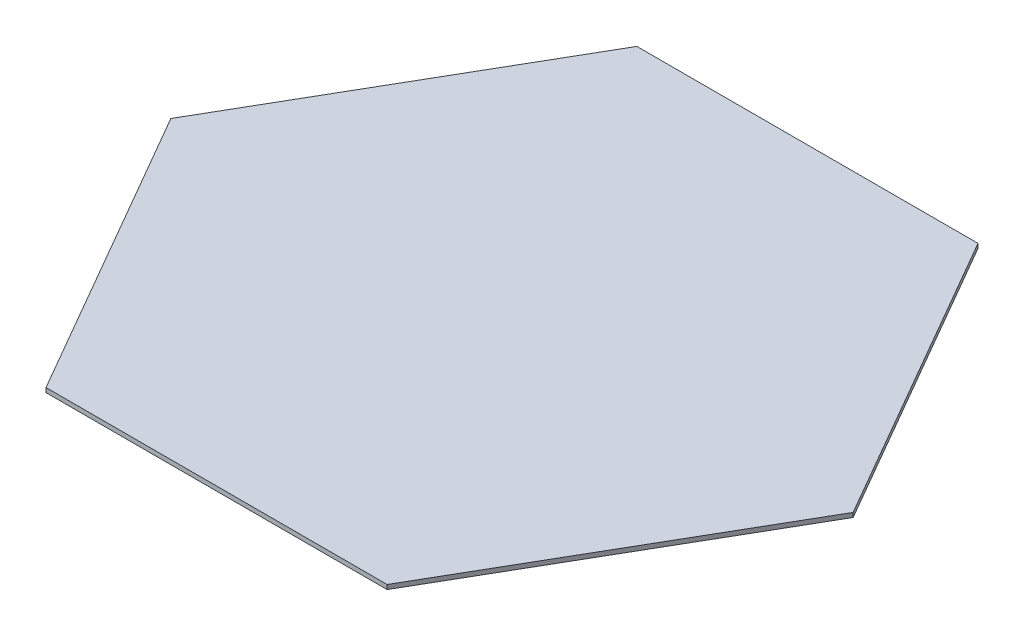
ISO-10303-21;
HEADER;
FILE_DESCRIPTION(('STEP AP214'),'2;1');
FILE_NAME('part.step','',(''),(''),'','','');
FILE_SCHEMA(('AUTOMOTIVE_DESIGN { 1 0 10303 214 1 1 1 1 }'));
ENDSEC;
DATA;
#1=APPLICATION_CONTEXT('core data for automotive mechanical design processes');
#2=APPLICATION_PROTOCOL_DEFINITION('international standard','automotive_design',2000,#1);
#3=PRODUCT_CONTEXT('',#1,'mechanical');
#4=PRODUCT('Part','Part','',(#3));
#5=PRODUCT_RELATED_PRODUCT_CATEGORY('part','',(#4));
#6=PRODUCT_DEFINITION_FORMATION('','',#4);
#7=PRODUCT_DEFINITION_CONTEXT('part definition',#1,'design');
#8=PRODUCT_DEFINITION('design','',#6,#7);
#9=PRODUCT_DEFINITION_SHAPE('','',#8);
#10=(LENGTH_UNIT() NAMED_UNIT(*) SI_UNIT(.MILLI.,.METRE.));
#11=(NAMED_UNIT(*) PLANE_ANGLE_UNIT() SI_UNIT($,.RADIAN.));
#12=(NAMED_UNIT(*) SI_UNIT($,.STERADIAN.) SOLID_ANGLE_UNIT());
#13=UNCERTAINTY_MEASURE_WITH_UNIT(LENGTH_MEASURE(1.E-05),#10,'distance_accuracy_value','');
#14=(GEOMETRIC_REPRESENTATION_CONTEXT(3) GLOBAL_UNCERTAINTY_ASSIGNED_CONTEXT((#13)) GLOBAL_UNIT_ASSIGNED_CONTEXT((#10,
#11,#12)) REPRESENTATION_CONTEXT('',''));
#15=CARTESIAN_POINT('',(0.,0.,0.));
#16=DIRECTION('',(0.,0.,1.));
#17=DIRECTION('',(1.,0.,0.));
#18=AXIS2_PLACEMENT_3D('',#15,#16,#17);
#19=CARTESIAN_POINT('',(115.470053837925,3.,200.));
#20=DIRECTION('',(-0.866025403784439,0.,-0.5));
#21=DIRECTION('',(-0.5,0.,0.866025403784439));
#22=AXIS2_PLACEMENT_3D('',#19,#20,#21);
#23=PLANE('',#22);
#24=DIRECTION('',(0.5,0.,-0.866025403784439));
#25=VECTOR('',#24,1.);
#26=CARTESIAN_POINT('',(115.470053837925,0.,200.));
#27=LINE('',#26,#25);
#28=CARTESIAN_POINT('',(115.470053837925,0.,200.));
#29=VERTEX_POINT('',#28);
#30=CARTESIAN_POINT('',(230.94010767585,0.,0.));
#31=VERTEX_POINT('',#30);
#32=EDGE_CURVE('E120',#29,#31,#27,.T.);
#33=ORIENTED_EDGE('',*,*,#32,.T.);
#34=DIRECTION('',(0.,-1.,0.));
#35=VECTOR('',#34,1.);
#36=CARTESIAN_POINT('',(230.94010767585,3.,0.));
#37=LINE('',#36,#35);
#38=CARTESIAN_POINT('',(230.94010767585,3.,0.));
#39=VERTEX_POINT('',#38);
#40=EDGE_CURVE('E11',#39,#31,#37,.T.);
#41=ORIENTED_EDGE('',*,*,#40,.F.);
#42=DIRECTION('',(0.5,0.,-0.866025403784439));
#43=VECTOR('',#42,1.);
#44=CARTESIAN_POINT('',(115.470053837925,3.,200.));
#45=LINE('',#44,#43);
#46=CARTESIAN_POINT('',(115.470053837925,3.,200.));
#47=VERTEX_POINT('',#46);
#48=EDGE_CURVE('E130',#47,#39,#45,.T.);
#49=ORIENTED_EDGE('',*,*,#48,.F.);
#50=DIRECTION('',(0.,-1.,0.));
#51=VECTOR('',#50,1.);
#52=CARTESIAN_POINT('',(115.470053837925,3.,200.));
#53=LINE('',#52,#51);
#54=EDGE_CURVE('E116',#47,#29,#53,.T.);
#55=ORIENTED_EDGE('',*,*,#54,.T.);
#56=EDGE_LOOP('',(#33,#41,#49,#55));
#57=FACE_BOUND('',#56,.T.);
#58=ADVANCED_FACE('F36',(#57),#23,.F.);
#59=CARTESIAN_POINT('',(230.94010767585,3.,0.));
#60=DIRECTION('',(-0.866025403784439,0.,0.5));
#61=DIRECTION('',(0.5,0.,0.866025403784439));
#62=AXIS2_PLACEMENT_3D('',#59,#60,#61);
#63=PLANE('',#62);
#64=DIRECTION('',(-0.5,0.,-0.866025403784439));
#65=VECTOR('',#64,1.);
#66=CARTESIAN_POINT('',(230.94010767585,0.,0.));
#67=LINE('',#66,#65);
#68=CARTESIAN_POINT('',(115.470053837925,0.,-200.));
#69=VERTEX_POINT('',#68);
#70=EDGE_CURVE('E123',#31,#69,#67,.T.);
#71=ORIENTED_EDGE('',*,*,#70,.T.);
#72=DIRECTION('',(0.,-1.,0.));
#73=VECTOR('',#72,1.);
#74=CARTESIAN_POINT('',(115.470053837925,3.,-200.));
#75=LINE('',#74,#73);
#76=CARTESIAN_POINT('',(115.470053837925,3.,-200.));
#77=VERTEX_POINT('',#76);
#78=EDGE_CURVE('E44',#77,#69,#75,.T.);
#79=ORIENTED_EDGE('',*,*,#78,.F.);
#80=DIRECTION('',(-0.5,0.,-0.866025403784439));
#81=VECTOR('',#80,1.);
#82=CARTESIAN_POINT('',(230.94010767585,3.,0.));
#83=LINE('',#82,#81);
#84=EDGE_CURVE('E89',#39,#77,#83,.T.);
#85=ORIENTED_EDGE('',*,*,#84,.F.);
#86=ORIENTED_EDGE('',*,*,#40,.T.);
#87=EDGE_LOOP('',(#71,#79,#85,#86));
#88=FACE_BOUND('',#87,.T.);
#89=ADVANCED_FACE('F154',(#88),#63,.F.);
#90=CARTESIAN_POINT('',(115.470053837925,3.,-200.));
#91=DIRECTION('',(0.,0.,1.));
#92=DIRECTION('',(1.,0.,0.));
#93=AXIS2_PLACEMENT_3D('',#90,#91,#92);
#94=PLANE('',#93);
#95=DIRECTION('',(-1.,0.,0.));
#96=VECTOR('',#95,1.);
#97=CARTESIAN_POINT('',(115.470053837925,0.,-200.));
#98=LINE('',#97,#96);
#99=CARTESIAN_POINT('',(-115.470053837925,0.,-200.));
#100=VERTEX_POINT('',#99);
#101=EDGE_CURVE('E125',#69,#100,#98,.T.);
#102=ORIENTED_EDGE('',*,*,#101,.T.);
#103=DIRECTION('',(0.,-1.,0.));
#104=VECTOR('',#103,1.);
#105=CARTESIAN_POINT('',(-115.470053837925,3.,-200.));
#106=LINE('',#105,#104);
#107=CARTESIAN_POINT('',(-115.470053837925,3.,-200.));
#108=VERTEX_POINT('',#107);
#109=EDGE_CURVE('E111',#108,#100,#106,.T.);
#110=ORIENTED_EDGE('',*,*,#109,.F.);
#111=DIRECTION('',(-1.,0.,0.));
#112=VECTOR('',#111,1.);
#113=CARTESIAN_POINT('',(115.470053837925,3.,-200.));
#114=LINE('',#113,#112);
#115=EDGE_CURVE('E102',#77,#108,#114,.T.);
#116=ORIENTED_EDGE('',*,*,#115,.F.);
#117=ORIENTED_EDGE('',*,*,#78,.T.);
#118=EDGE_LOOP('',(#102,#110,#116,#117));
#119=FACE_BOUND('',#118,.T.);
#120=ADVANCED_FACE('F136',(#119),#94,.F.);
#121=CARTESIAN_POINT('',(-115.470053837925,3.,-200.));
#122=DIRECTION('',(0.866025403784439,0.,0.5));
#123=DIRECTION('',(0.5,0.,-0.866025403784439));
#124=AXIS2_PLACEMENT_3D('',#121,#122,#123);
#125=PLANE('',#124);
#126=DIRECTION('',(-0.5,0.,0.866025403784439));
#127=VECTOR('',#126,1.);
#128=CARTESIAN_POINT('',(-115.470053837925,0.,-200.));
#129=LINE('',#128,#127);
#130=CARTESIAN_POINT('',(-230.94010767585,0.,0.));
#131=VERTEX_POINT('',#130);
#132=EDGE_CURVE('E110',#100,#131,#129,.T.);
#133=ORIENTED_EDGE('',*,*,#132,.T.);
#134=DIRECTION('',(0.,-1.,0.));
#135=VECTOR('',#134,1.);
#136=CARTESIAN_POINT('',(-230.94010767585,3.,0.));
#137=LINE('',#136,#135);
#138=CARTESIAN_POINT('',(-230.94010767585,3.,0.));
#139=VERTEX_POINT('',#138);
#140=EDGE_CURVE('E107',#139,#131,#137,.T.);
#141=ORIENTED_EDGE('',*,*,#140,.F.);
#142=DIRECTION('',(-0.5,0.,0.866025403784439));
#143=VECTOR('',#142,1.);
#144=CARTESIAN_POINT('',(-115.470053837925,3.,-200.));
#145=LINE('',#144,#143);
#146=EDGE_CURVE('E96',#108,#139,#145,.T.);
#147=ORIENTED_EDGE('',*,*,#146,.F.);
#148=ORIENTED_EDGE('',*,*,#109,.T.);
#149=EDGE_LOOP('',(#133,#141,#147,#148));
#150=FACE_BOUND('',#149,.T.);
#151=ADVANCED_FACE('F108',(#150),#125,.F.);
#152=CARTESIAN_POINT('',(-230.94010767585,3.,0.));
#153=DIRECTION('',(0.866025403784439,0.,-0.5));
#154=DIRECTION('',(-0.5,0.,-0.866025403784439));
#155=AXIS2_PLACEMENT_3D('',#152,#153,#154);
#156=PLANE('',#155);
#157=DIRECTION('',(0.5,0.,0.866025403784438));
#158=VECTOR('',#157,1.);
#159=CARTESIAN_POINT('',(-230.94010767585,0.,0.));
#160=LINE('',#159,#158);
#161=CARTESIAN_POINT('',(-115.470053837925,0.,200.));
#162=VERTEX_POINT('',#161);
#163=EDGE_CURVE('E75',#131,#162,#160,.T.);
#164=ORIENTED_EDGE('',*,*,#163,.T.);
#165=DIRECTION('',(0.,-1.,0.));
#166=VECTOR('',#165,1.);
#167=CARTESIAN_POINT('',(-115.470053837925,3.,200.));
#168=LINE('',#167,#166);
#169=CARTESIAN_POINT('',(-115.470053837925,3.,200.));
#170=VERTEX_POINT('',#169);
#171=EDGE_CURVE('E112',#170,#162,#168,.T.);
#172=ORIENTED_EDGE('',*,*,#171,.F.);
#173=DIRECTION('',(0.5,0.,0.866025403784438));
#174=VECTOR('',#173,1.);
#175=CARTESIAN_POINT('',(-230.94010767585,3.,0.));
#176=LINE('',#175,#174);
#177=EDGE_CURVE('E100',#139,#170,#176,.T.);
#178=ORIENTED_EDGE('',*,*,#177,.F.);
#179=ORIENTED_EDGE('',*,*,#140,.T.);
#180=EDGE_LOOP('',(#164,#172,#178,#179));
#181=FACE_BOUND('',#180,.T.);
#182=ADVANCED_FACE('F114',(#181),#156,.F.);
#183=CARTESIAN_POINT('',(-115.470053837925,3.,200.));
#184=DIRECTION('',(0.,0.,-1.));
#185=DIRECTION('',(-1.,0.,0.));
#186=AXIS2_PLACEMENT_3D('',#183,#184,#185);
#187=PLANE('',#186);
#188=DIRECTION('',(1.,0.,0.));
#189=VECTOR('',#188,1.);
#190=CARTESIAN_POINT('',(-115.470053837925,0.,200.));
#191=LINE('',#190,#189);
#192=EDGE_CURVE('E81',#162,#29,#191,.T.);
#193=ORIENTED_EDGE('',*,*,#192,.T.);
#194=ORIENTED_EDGE('',*,*,#54,.F.);
#195=DIRECTION('',(1.,0.,0.));
#196=VECTOR('',#195,1.);
#197=CARTESIAN_POINT('',(-115.470053837925,3.,200.));
#198=LINE('',#197,#196);
#199=EDGE_CURVE('E52',#170,#47,#198,.T.);
#200=ORIENTED_EDGE('',*,*,#199,.F.);
#201=ORIENTED_EDGE('',*,*,#171,.T.);
#202=EDGE_LOOP('',(#193,#194,#200,#201));
#203=FACE_BOUND('',#202,.T.);
#204=ADVANCED_FACE('F143',(#203),#187,.F.);
#205=CARTESIAN_POINT('',(0.,3.,0.));
#206=DIRECTION('',(0.,1.,0.));
#207=DIRECTION('',(0.,0.,1.));
#208=AXIS2_PLACEMENT_3D('',#205,#206,#207);
#209=PLANE('',#208);
#210=ORIENTED_EDGE('',*,*,#48,.T.);
#211=ORIENTED_EDGE('',*,*,#84,.T.);
#212=ORIENTED_EDGE('',*,*,#115,.T.);
#213=ORIENTED_EDGE('',*,*,#146,.T.);
#214=ORIENTED_EDGE('',*,*,#177,.T.);
#215=ORIENTED_EDGE('',*,*,#199,.T.);
#216=EDGE_LOOP('',(#210,#211,#212,#213,#214,#215));
#217=FACE_BOUND('',#216,.T.);
#218=ADVANCED_FACE('F98',(#217),#209,.T.);
#219=CARTESIAN_POINT('',(0.,0.,0.));
#220=DIRECTION('',(0.,1.,0.));
#221=DIRECTION('',(0.,0.,1.));
#222=AXIS2_PLACEMENT_3D('',#219,#220,#221);
#223=PLANE('',#222);
#224=ORIENTED_EDGE('',*,*,#32,.F.);
#225=ORIENTED_EDGE('',*,*,#192,.F.);
#226=ORIENTED_EDGE('',*,*,#163,.F.);
#227=ORIENTED_EDGE('',*,*,#132,.F.);
#228=ORIENTED_EDGE('',*,*,#101,.F.);
#229=ORIENTED_EDGE('',*,*,#70,.F.);
#230=EDGE_LOOP('',(#224,#225,#226,#227,#228,#229));
#231=FACE_BOUND('',#230,.T.);
#232=ADVANCED_FACE('F139',(#231),#223,.F.);
#233=CLOSED_SHELL('',(#58,#89,#120,#151,#182,#204,#218,#232));
#234=MANIFOLD_SOLID_BREP('B2',#233);
#235=ADVANCED_BREP_SHAPE_REPRESENTATION('',(#18,#234),#14);
#236=SHAPE_DEFINITION_REPRESENTATION(#9,#235);
ENDSEC;
END-ISO-10303-21;
